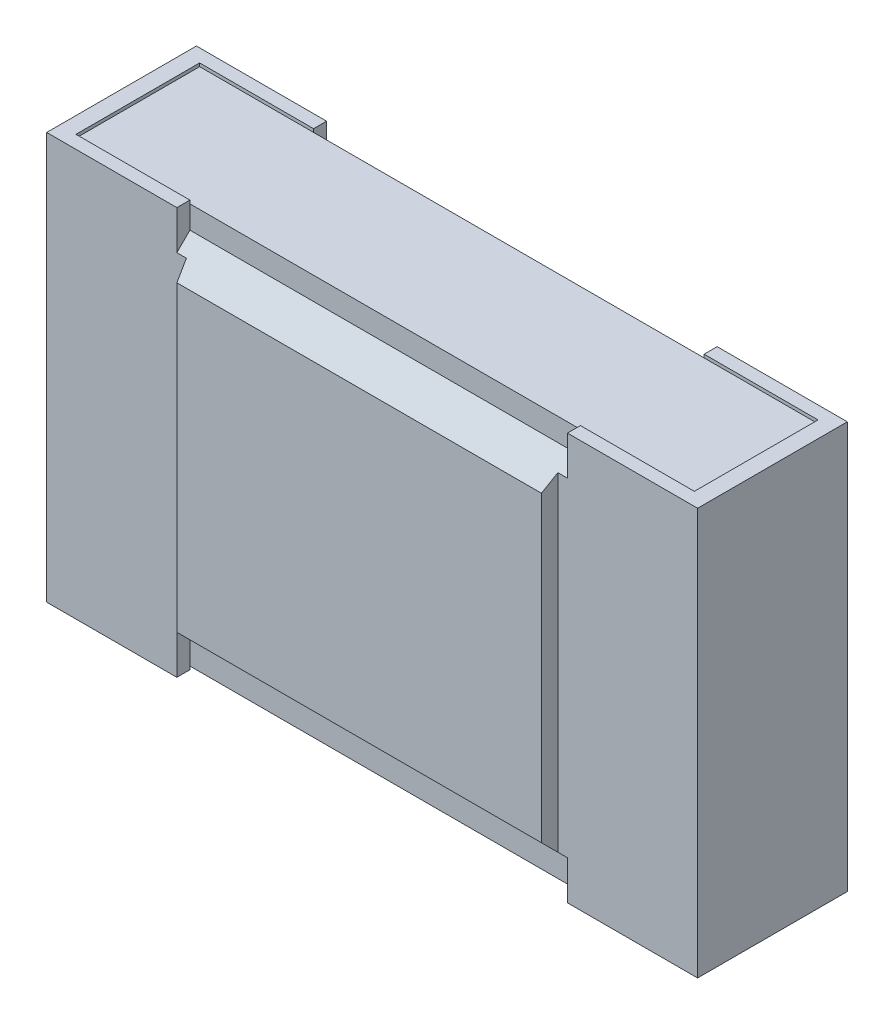
ISO-10303-21;
HEADER;
FILE_DESCRIPTION(('STEP AP214'),'2;1');
FILE_NAME('part.step','',(''),(''),'','','');
FILE_SCHEMA(('AUTOMOTIVE_DESIGN { 1 0 10303 214 1 1 1 1 }'));
ENDSEC;
DATA;
#1=APPLICATION_CONTEXT('core data for automotive mechanical design processes');
#2=APPLICATION_PROTOCOL_DEFINITION('international standard','automotive_design',2000,#1);
#3=PRODUCT_CONTEXT('',#1,'mechanical');
#4=PRODUCT('Part','Part','',(#3));
#5=PRODUCT_RELATED_PRODUCT_CATEGORY('part','',(#4));
#6=PRODUCT_DEFINITION_FORMATION('','',#4);
#7=PRODUCT_DEFINITION_CONTEXT('part definition',#1,'design');
#8=PRODUCT_DEFINITION('design','',#6,#7);
#9=PRODUCT_DEFINITION_SHAPE('','',#8);
#10=(LENGTH_UNIT() NAMED_UNIT(*) SI_UNIT(.MILLI.,.METRE.));
#11=(NAMED_UNIT(*) PLANE_ANGLE_UNIT() SI_UNIT($,.RADIAN.));
#12=(NAMED_UNIT(*) SI_UNIT($,.STERADIAN.) SOLID_ANGLE_UNIT());
#13=UNCERTAINTY_MEASURE_WITH_UNIT(LENGTH_MEASURE(1.E-05),#10,'distance_accuracy_value','');
#14=(GEOMETRIC_REPRESENTATION_CONTEXT(3) GLOBAL_UNCERTAINTY_ASSIGNED_CONTEXT((#13)) GLOBAL_UNIT_ASSIGNED_CONTEXT((#10,
#11,#12)) REPRESENTATION_CONTEXT('',''));
#15=CARTESIAN_POINT('',(0.,0.,0.));
#16=DIRECTION('',(0.,0.,1.));
#17=DIRECTION('',(1.,0.,0.));
#18=AXIS2_PLACEMENT_3D('',#15,#16,#17);
#19=CARTESIAN_POINT('',(0.6,-0.625,0.350717967697239));
#20=DIRECTION('',(0.965925826289069,0.,0.258819045102518));
#21=DIRECTION('',(0.258819045102518,0.,-0.965925826289069));
#22=AXIS2_PLACEMENT_3D('',#19,#20,#21);
#23=PLANE('',#22);
#24=DIRECTION('',(-0.186156787897384,0.694746590606862,0.69474659060687));
#25=VECTOR('',#24,1.);
#26=CARTESIAN_POINT('',(0.570717967697244,-0.504999999999999,0.46));
#27=LINE('',#26,#25);
#28=CARTESIAN_POINT('',(0.570717967697244,-0.504999999999999,0.46));
#29=VERTEX_POINT('',#28);
#30=CARTESIAN_POINT('',(0.559999999999999,-0.464999999999999,0.5));
#31=VERTEX_POINT('',#30);
#32=EDGE_CURVE('E277',#29,#31,#27,.T.);
#33=ORIENTED_EDGE('',*,*,#32,.F.);
#34=DIRECTION('',(0.,1.,0.));
#35=VECTOR('',#34,1.);
#36=CARTESIAN_POINT('',(0.570717967697244,0.,0.46));
#37=LINE('',#36,#35);
#38=CARTESIAN_POINT('',(0.570717967697244,0.504999999999999,0.46));
#39=VERTEX_POINT('',#38);
#40=EDGE_CURVE('E230',#39,#29,#37,.F.);
#41=ORIENTED_EDGE('',*,*,#40,.F.);
#42=DIRECTION('',(0.186156787897384,0.694746590606862,-0.69474659060687));
#43=VECTOR('',#42,1.);
#44=CARTESIAN_POINT('',(0.559999999999999,0.464999999999999,0.5));
#45=LINE('',#44,#43);
#46=CARTESIAN_POINT('',(0.559999999999999,0.464999999999999,0.5));
#47=VERTEX_POINT('',#46);
#48=EDGE_CURVE('E226',#47,#39,#45,.T.);
#49=ORIENTED_EDGE('',*,*,#48,.F.);
#50=DIRECTION('',(0.,1.,0.));
#51=VECTOR('',#50,1.);
#52=CARTESIAN_POINT('',(0.559999999999999,0.,0.5));
#53=LINE('',#52,#51);
#54=EDGE_CURVE('E19',#31,#47,#53,.T.);
#55=ORIENTED_EDGE('',*,*,#54,.F.);
#56=EDGE_LOOP('',(#33,#41,#49,#55));
#57=FACE_BOUND('',#56,.T.);
#58=ADVANCED_FACE('F16',(#57),#23,.T.);
#59=CARTESIAN_POINT('',(0.,0.,0.5));
#60=DIRECTION('',(0.,0.,1.));
#61=DIRECTION('',(1.,0.,0.));
#62=AXIS2_PLACEMENT_3D('',#59,#60,#61);
#63=PLANE('',#62);
#64=DIRECTION('',(1.,0.,0.));
#65=VECTOR('',#64,1.);
#66=CARTESIAN_POINT('',(-0.6,0.464999999999999,0.5));
#67=LINE('',#66,#65);
#68=CARTESIAN_POINT('',(-0.559999999999999,0.464999999999999,0.5));
#69=VERTEX_POINT('',#68);
#70=EDGE_CURVE('E240',#69,#47,#67,.T.);
#71=ORIENTED_EDGE('',*,*,#70,.F.);
#72=DIRECTION('',(0.,1.,0.));
#73=VECTOR('',#72,1.);
#74=CARTESIAN_POINT('',(-0.559999999999999,-0.625,0.5));
#75=LINE('',#74,#73);
#76=CARTESIAN_POINT('',(-0.559999999999999,-0.464999999999999,0.5));
#77=VERTEX_POINT('',#76);
#78=EDGE_CURVE('E245',#77,#69,#75,.T.);
#79=ORIENTED_EDGE('',*,*,#78,.F.);
#80=DIRECTION('',(1.,0.,0.));
#81=VECTOR('',#80,1.);
#82=CARTESIAN_POINT('',(-0.6,-0.464999999999999,0.5));
#83=LINE('',#82,#81);
#84=EDGE_CURVE('E243',#31,#77,#83,.F.);
#85=ORIENTED_EDGE('',*,*,#84,.F.);
#86=ORIENTED_EDGE('',*,*,#54,.T.);
#87=EDGE_LOOP('',(#71,#79,#85,#86));
#88=FACE_BOUND('',#87,.T.);
#89=ADVANCED_FACE('F239',(#88),#63,.T.);
#90=CARTESIAN_POINT('',(-0.6,-0.625,0.350717967697239));
#91=DIRECTION('',(-0.965925826289069,0.,0.258819045102518));
#92=DIRECTION('',(0.258819045102518,0.,0.965925826289069));
#93=AXIS2_PLACEMENT_3D('',#90,#91,#92);
#94=PLANE('',#93);
#95=DIRECTION('',(0.186156787897384,-0.694746590606862,0.69474659060687));
#96=VECTOR('',#95,1.);
#97=CARTESIAN_POINT('',(-0.570717967697243,0.504999999999999,0.46));
#98=LINE('',#97,#96);
#99=CARTESIAN_POINT('',(-0.570717967697243,0.504999999999999,0.46));
#100=VERTEX_POINT('',#99);
#101=EDGE_CURVE('E249',#100,#69,#98,.T.);
#102=ORIENTED_EDGE('',*,*,#101,.F.);
#103=DIRECTION('',(0.,1.,0.));
#104=VECTOR('',#103,1.);
#105=CARTESIAN_POINT('',(-0.570717967697243,0.,0.46));
#106=LINE('',#105,#104);
#107=CARTESIAN_POINT('',(-0.570717967697243,-0.504999999999999,0.46));
#108=VERTEX_POINT('',#107);
#109=EDGE_CURVE('E264',#100,#108,#106,.F.);
#110=ORIENTED_EDGE('',*,*,#109,.T.);
#111=DIRECTION('',(-0.186156787897385,-0.694746590606862,-0.69474659060687));
#112=VECTOR('',#111,1.);
#113=CARTESIAN_POINT('',(-0.559999999999999,-0.464999999999999,0.5));
#114=LINE('',#113,#112);
#115=EDGE_CURVE('E269',#77,#108,#114,.T.);
#116=ORIENTED_EDGE('',*,*,#115,.F.);
#117=ORIENTED_EDGE('',*,*,#78,.T.);
#118=EDGE_LOOP('',(#102,#110,#116,#117));
#119=FACE_BOUND('',#118,.T.);
#120=ADVANCED_FACE('F267',(#119),#94,.T.);
#121=CARTESIAN_POINT('',(0.,0.,0.46));
#122=DIRECTION('',(0.,0.,-1.));
#123=DIRECTION('',(-1.,0.,0.));
#124=AXIS2_PLACEMENT_3D('',#121,#122,#123);
#125=PLANE('',#124);
#126=DIRECTION('',(1.,0.,0.));
#127=VECTOR('',#126,1.);
#128=CARTESIAN_POINT('',(-0.6,-0.504999999999999,0.46));
#129=LINE('',#128,#127);
#130=CARTESIAN_POINT('',(-0.6,-0.504999999999999,0.46));
#131=VERTEX_POINT('',#130);
#132=EDGE_CURVE('E273',#108,#131,#129,.F.);
#133=ORIENTED_EDGE('',*,*,#132,.F.);
#134=ORIENTED_EDGE('',*,*,#109,.F.);
#135=DIRECTION('',(1.,0.,0.));
#136=VECTOR('',#135,1.);
#137=CARTESIAN_POINT('',(-0.6,0.504999999999999,0.46));
#138=LINE('',#137,#136);
#139=CARTESIAN_POINT('',(-0.6,0.504999999999999,0.46));
#140=VERTEX_POINT('',#139);
#141=EDGE_CURVE('E254',#140,#100,#138,.T.);
#142=ORIENTED_EDGE('',*,*,#141,.F.);
#143=DIRECTION('',(0.,1.,0.));
#144=VECTOR('',#143,1.);
#145=CARTESIAN_POINT('',(-0.6,0.625,0.46));
#146=LINE('',#145,#144);
#147=CARTESIAN_POINT('',(-0.6,0.625,0.46));
#148=VERTEX_POINT('',#147);
#149=EDGE_CURVE('E221',#140,#148,#146,.T.);
#150=ORIENTED_EDGE('',*,*,#149,.T.);
#151=DIRECTION('',(1.,0.,0.));
#152=VECTOR('',#151,1.);
#153=CARTESIAN_POINT('',(1.,0.625,0.46));
#154=LINE('',#153,#152);
#155=CARTESIAN_POINT('',(-1.,0.625,0.46));
#156=VERTEX_POINT('',#155);
#157=EDGE_CURVE('E339',#148,#156,#154,.F.);
#158=ORIENTED_EDGE('',*,*,#157,.T.);
#159=DIRECTION('',(0.,1.,0.));
#160=VECTOR('',#159,1.);
#161=CARTESIAN_POINT('',(-1.,-0.625,0.46));
#162=LINE('',#161,#160);
#163=CARTESIAN_POINT('',(-1.,-0.625,0.46));
#164=VERTEX_POINT('',#163);
#165=EDGE_CURVE('E262',#156,#164,#162,.F.);
#166=ORIENTED_EDGE('',*,*,#165,.T.);
#167=DIRECTION('',(-1.,0.,0.));
#168=VECTOR('',#167,1.);
#169=CARTESIAN_POINT('',(1.,-0.625,0.46));
#170=LINE('',#169,#168);
#171=CARTESIAN_POINT('',(-0.6,-0.625,0.46));
#172=VERTEX_POINT('',#171);
#173=EDGE_CURVE('E345',#164,#172,#170,.F.);
#174=ORIENTED_EDGE('',*,*,#173,.T.);
#175=DIRECTION('',(0.,1.,0.));
#176=VECTOR('',#175,1.);
#177=CARTESIAN_POINT('',(-0.6,-0.625,0.46));
#178=LINE('',#177,#176);
#179=EDGE_CURVE('E352',#172,#131,#178,.T.);
#180=ORIENTED_EDGE('',*,*,#179,.T.);
#181=EDGE_LOOP('',(#133,#134,#142,#150,#158,#166,#174,#180));
#182=FACE_BOUND('',#181,.T.);
#183=ADVANCED_FACE('F894',(#182),#125,.F.);
#184=CARTESIAN_POINT('',(-1.,-0.625,0.5));
#185=DIRECTION('',(1.,0.,0.));
#186=DIRECTION('',(0.,0.,-1.));
#187=AXIS2_PLACEMENT_3D('',#184,#185,#186);
#188=PLANE('',#187);
#189=ORIENTED_EDGE('',*,*,#165,.F.);
#190=DIRECTION('',(0.,0.,1.));
#191=VECTOR('',#190,1.);
#192=CARTESIAN_POINT('',(-1.,0.625,0.5));
#193=LINE('',#192,#191);
#194=CARTESIAN_POINT('',(-1.,0.625,0.));
#195=VERTEX_POINT('',#194);
#196=EDGE_CURVE('E337',#156,#195,#193,.F.);
#197=ORIENTED_EDGE('',*,*,#196,.T.);
#198=DIRECTION('',(0.,1.,0.));
#199=VECTOR('',#198,1.);
#200=CARTESIAN_POINT('',(-1.,0.,0.));
#201=LINE('',#200,#199);
#202=CARTESIAN_POINT('',(-1.,-0.625,0.));
#203=VERTEX_POINT('',#202);
#204=EDGE_CURVE('E335',#195,#203,#201,.F.);
#205=ORIENTED_EDGE('',*,*,#204,.T.);
#206=DIRECTION('',(0.,0.,1.));
#207=VECTOR('',#206,1.);
#208=CARTESIAN_POINT('',(-1.,-0.625,0.5));
#209=LINE('',#208,#207);
#210=EDGE_CURVE('E347',#203,#164,#209,.T.);
#211=ORIENTED_EDGE('',*,*,#210,.T.);
#212=EDGE_LOOP('',(#189,#197,#205,#211));
#213=FACE_BOUND('',#212,.T.);
#214=ADVANCED_FACE('F886',(#213),#188,.F.);
#215=CARTESIAN_POINT('',(-0.6,0.625,0.42));
#216=DIRECTION('',(-1.,0.,0.));
#217=DIRECTION('',(0.,0.,1.));
#218=AXIS2_PLACEMENT_3D('',#215,#216,#217);
#219=PLANE('',#218);
#220=DIRECTION('',(0.,-0.707106781186544,0.707106781186551));
#221=VECTOR('',#220,1.);
#222=CARTESIAN_POINT('',(-0.6,0.605,0.359999999999998));
#223=LINE('',#222,#221);
#224=CARTESIAN_POINT('',(-0.6,0.544999999999998,0.42));
#225=VERTEX_POINT('',#224);
#226=EDGE_CURVE('E235',#225,#140,#223,.T.);
#227=ORIENTED_EDGE('',*,*,#226,.F.);
#228=DIRECTION('',(0.,1.,0.));
#229=VECTOR('',#228,1.);
#230=CARTESIAN_POINT('',(-0.599999999999999,0.,0.42));
#231=LINE('',#230,#229);
#232=CARTESIAN_POINT('',(-0.6,0.615,0.42));
#233=VERTEX_POINT('',#232);
#234=EDGE_CURVE('E308',#233,#225,#231,.F.);
#235=ORIENTED_EDGE('',*,*,#234,.F.);
#236=DIRECTION('',(0.,1.,0.));
#237=VECTOR('',#236,1.);
#238=CARTESIAN_POINT('',(-0.599999999999999,0.615,0.42));
#239=LINE('',#238,#237);
#240=CARTESIAN_POINT('',(-0.6,0.625,0.42));
#241=VERTEX_POINT('',#240);
#242=EDGE_CURVE('E326',#241,#233,#239,.F.);
#243=ORIENTED_EDGE('',*,*,#242,.F.);
#244=DIRECTION('',(0.,0.,1.));
#245=VECTOR('',#244,1.);
#246=CARTESIAN_POINT('',(-0.599999999999999,0.625,0.5));
#247=LINE('',#246,#245);
#248=EDGE_CURVE('E341',#241,#148,#247,.T.);
#249=ORIENTED_EDGE('',*,*,#248,.T.);
#250=ORIENTED_EDGE('',*,*,#149,.F.);
#251=EDGE_LOOP('',(#227,#235,#243,#249,#250));
#252=FACE_BOUND('',#251,.T.);
#253=ADVANCED_FACE('F877',(#252),#219,.F.);
#254=CARTESIAN_POINT('',(-0.6,0.605,0.359999999999998));
#255=DIRECTION('',(0.,0.707106781186551,0.707106781186544));
#256=DIRECTION('',(0.,-0.707106781186544,0.707106781186551));
#257=AXIS2_PLACEMENT_3D('',#254,#255,#256);
#258=PLANE('',#257);
#259=ORIENTED_EDGE('',*,*,#101,.T.);
#260=ORIENTED_EDGE('',*,*,#70,.T.);
#261=ORIENTED_EDGE('',*,*,#48,.T.);
#262=DIRECTION('',(1.,0.,0.));
#263=VECTOR('',#262,1.);
#264=CARTESIAN_POINT('',(0.,0.504999999999999,0.46));
#265=LINE('',#264,#263);
#266=CARTESIAN_POINT('',(0.6,0.504999999999999,0.46));
#267=VERTEX_POINT('',#266);
#268=EDGE_CURVE('E287',#267,#39,#265,.F.);
#269=ORIENTED_EDGE('',*,*,#268,.F.);
#270=DIRECTION('',(0.,0.707106781186543,-0.707106781186552));
#271=VECTOR('',#270,1.);
#272=CARTESIAN_POINT('',(0.6,0.504999999999999,0.46));
#273=LINE('',#272,#271);
#274=CARTESIAN_POINT('',(0.6,0.544999999999998,0.42));
#275=VERTEX_POINT('',#274);
#276=EDGE_CURVE('E250',#267,#275,#273,.T.);
#277=ORIENTED_EDGE('',*,*,#276,.T.);
#278=DIRECTION('',(1.,0.,0.));
#279=VECTOR('',#278,1.);
#280=CARTESIAN_POINT('',(0.,0.544999999999998,0.42));
#281=LINE('',#280,#279);
#282=EDGE_CURVE('E304',#225,#275,#281,.T.);
#283=ORIENTED_EDGE('',*,*,#282,.F.);
#284=ORIENTED_EDGE('',*,*,#226,.T.);
#285=ORIENTED_EDGE('',*,*,#141,.T.);
#286=EDGE_LOOP('',(#259,#260,#261,#269,#277,#283,#284,#285));
#287=FACE_BOUND('',#286,.T.);
#288=ADVANCED_FACE('F246',(#287),#258,.T.);
#289=CARTESIAN_POINT('',(0.6,0.625,0.42));
#290=DIRECTION('',(1.,0.,0.));
#291=DIRECTION('',(0.,0.,-1.));
#292=AXIS2_PLACEMENT_3D('',#289,#290,#291);
#293=PLANE('',#292);
#294=DIRECTION('',(0.,0.,1.));
#295=VECTOR('',#294,1.);
#296=CARTESIAN_POINT('',(0.6,0.625,0.5));
#297=LINE('',#296,#295);
#298=CARTESIAN_POINT('',(0.6,0.625,0.46));
#299=VERTEX_POINT('',#298);
#300=CARTESIAN_POINT('',(0.6,0.625,0.42));
#301=VERTEX_POINT('',#300);
#302=EDGE_CURVE('E297',#299,#301,#297,.F.);
#303=ORIENTED_EDGE('',*,*,#302,.T.);
#304=DIRECTION('',(0.,1.,0.));
#305=VECTOR('',#304,1.);
#306=CARTESIAN_POINT('',(0.6,0.615,0.42));
#307=LINE('',#306,#305);
#308=CARTESIAN_POINT('',(0.6,0.615,0.42));
#309=VERTEX_POINT('',#308);
#310=EDGE_CURVE('E307',#309,#301,#307,.T.);
#311=ORIENTED_EDGE('',*,*,#310,.F.);
#312=DIRECTION('',(0.,1.,0.));
#313=VECTOR('',#312,1.);
#314=CARTESIAN_POINT('',(0.6,0.,0.42));
#315=LINE('',#314,#313);
#316=EDGE_CURVE('E301',#275,#309,#315,.T.);
#317=ORIENTED_EDGE('',*,*,#316,.F.);
#318=ORIENTED_EDGE('',*,*,#276,.F.);
#319=DIRECTION('',(0.,1.,0.));
#320=VECTOR('',#319,1.);
#321=CARTESIAN_POINT('',(0.6,0.,0.46));
#322=LINE('',#321,#320);
#323=EDGE_CURVE('E252',#299,#267,#322,.F.);
#324=ORIENTED_EDGE('',*,*,#323,.F.);
#325=EDGE_LOOP('',(#303,#311,#317,#318,#324));
#326=FACE_BOUND('',#325,.T.);
#327=ADVANCED_FACE('F296',(#326),#293,.F.);
#328=CARTESIAN_POINT('',(0.,0.,0.46));
#329=DIRECTION('',(0.,0.,1.));
#330=DIRECTION('',(1.,0.,0.));
#331=AXIS2_PLACEMENT_3D('',#328,#329,#330);
#332=PLANE('',#331);
#333=DIRECTION('',(0.,1.,0.));
#334=VECTOR('',#333,1.);
#335=CARTESIAN_POINT('',(1.,-0.625,0.46));
#336=LINE('',#335,#334);
#337=CARTESIAN_POINT('',(1.,-0.625,0.46));
#338=VERTEX_POINT('',#337);
#339=CARTESIAN_POINT('',(1.,0.625,0.46));
#340=VERTEX_POINT('',#339);
#341=EDGE_CURVE('E284',#338,#340,#336,.T.);
#342=ORIENTED_EDGE('',*,*,#341,.T.);
#343=DIRECTION('',(1.,0.,0.));
#344=VECTOR('',#343,1.);
#345=CARTESIAN_POINT('',(1.,0.625,0.46));
#346=LINE('',#345,#344);
#347=EDGE_CURVE('E293',#340,#299,#346,.F.);
#348=ORIENTED_EDGE('',*,*,#347,.T.);
#349=ORIENTED_EDGE('',*,*,#323,.T.);
#350=ORIENTED_EDGE('',*,*,#268,.T.);
#351=ORIENTED_EDGE('',*,*,#40,.T.);
#352=DIRECTION('',(1.,0.,0.));
#353=VECTOR('',#352,1.);
#354=CARTESIAN_POINT('',(-0.6,-0.504999999999999,0.46));
#355=LINE('',#354,#353);
#356=CARTESIAN_POINT('',(0.6,-0.504999999999999,0.46));
#357=VERTEX_POINT('',#356);
#358=EDGE_CURVE('E279',#357,#29,#355,.F.);
#359=ORIENTED_EDGE('',*,*,#358,.F.);
#360=DIRECTION('',(0.,1.,0.));
#361=VECTOR('',#360,1.);
#362=CARTESIAN_POINT('',(0.6,-0.625,0.46));
#363=LINE('',#362,#361);
#364=CARTESIAN_POINT('',(0.6,-0.625,0.46));
#365=VERTEX_POINT('',#364);
#366=EDGE_CURVE('E354',#357,#365,#363,.F.);
#367=ORIENTED_EDGE('',*,*,#366,.T.);
#368=DIRECTION('',(-1.,0.,0.));
#369=VECTOR('',#368,1.);
#370=CARTESIAN_POINT('',(1.,-0.625,0.46));
#371=LINE('',#370,#369);
#372=EDGE_CURVE('E414',#365,#338,#371,.F.);
#373=ORIENTED_EDGE('',*,*,#372,.T.);
#374=EDGE_LOOP('',(#342,#348,#349,#350,#351,#359,#367,#373));
#375=FACE_BOUND('',#374,.T.);
#376=ADVANCED_FACE('F291',(#375),#332,.T.);
#377=CARTESIAN_POINT('',(1.,-0.625,0.5));
#378=DIRECTION('',(-1.,0.,0.));
#379=DIRECTION('',(0.,0.,1.));
#380=AXIS2_PLACEMENT_3D('',#377,#378,#379);
#381=PLANE('',#380);
#382=DIRECTION('',(0.,0.,1.));
#383=VECTOR('',#382,1.);
#384=CARTESIAN_POINT('',(1.,-0.625,0.5));
#385=LINE('',#384,#383);
#386=CARTESIAN_POINT('',(1.,-0.625,0.));
#387=VERTEX_POINT('',#386);
#388=EDGE_CURVE('E412',#338,#387,#385,.F.);
#389=ORIENTED_EDGE('',*,*,#388,.T.);
#390=DIRECTION('',(0.,1.,0.));
#391=VECTOR('',#390,1.);
#392=CARTESIAN_POINT('',(1.,0.,0.));
#393=LINE('',#392,#391);
#394=CARTESIAN_POINT('',(1.,0.625,0.));
#395=VERTEX_POINT('',#394);
#396=EDGE_CURVE('E407',#387,#395,#393,.T.);
#397=ORIENTED_EDGE('',*,*,#396,.T.);
#398=DIRECTION('',(0.,0.,1.));
#399=VECTOR('',#398,1.);
#400=CARTESIAN_POINT('',(1.,0.625,0.5));
#401=LINE('',#400,#399);
#402=EDGE_CURVE('E428',#395,#340,#401,.T.);
#403=ORIENTED_EDGE('',*,*,#402,.T.);
#404=ORIENTED_EDGE('',*,*,#341,.F.);
#405=EDGE_LOOP('',(#389,#397,#403,#404));
#406=FACE_BOUND('',#405,.T.);
#407=ADVANCED_FACE('F593',(#406),#381,.F.);
#408=CARTESIAN_POINT('',(-0.6,-0.605,0.359999999999998));
#409=DIRECTION('',(0.,-0.707106781186551,0.707106781186544));
#410=DIRECTION('',(0.,-0.707106781186544,-0.707106781186551));
#411=AXIS2_PLACEMENT_3D('',#408,#409,#410);
#412=PLANE('',#411);
#413=DIRECTION('',(0.,-0.707106781186544,-0.707106781186551));
#414=VECTOR('',#413,1.);
#415=CARTESIAN_POINT('',(-0.6,-0.504999999999999,0.46));
#416=LINE('',#415,#414);
#417=CARTESIAN_POINT('',(-0.6,-0.544999999999998,0.42));
#418=VERTEX_POINT('',#417);
#419=EDGE_CURVE('E350',#131,#418,#416,.T.);
#420=ORIENTED_EDGE('',*,*,#419,.T.);
#421=DIRECTION('',(-1.,0.,0.));
#422=VECTOR('',#421,1.);
#423=CARTESIAN_POINT('',(0.,-0.544999999999998,0.42));
#424=LINE('',#423,#422);
#425=CARTESIAN_POINT('',(0.6,-0.544999999999998,0.42));
#426=VERTEX_POINT('',#425);
#427=EDGE_CURVE('E373',#418,#426,#424,.F.);
#428=ORIENTED_EDGE('',*,*,#427,.T.);
#429=DIRECTION('',(0.,0.707106781186544,0.707106781186551));
#430=VECTOR('',#429,1.);
#431=CARTESIAN_POINT('',(0.6,-0.544999999999998,0.42));
#432=LINE('',#431,#430);
#433=EDGE_CURVE('E356',#426,#357,#432,.T.);
#434=ORIENTED_EDGE('',*,*,#433,.T.);
#435=ORIENTED_EDGE('',*,*,#358,.T.);
#436=ORIENTED_EDGE('',*,*,#32,.T.);
#437=ORIENTED_EDGE('',*,*,#84,.T.);
#438=ORIENTED_EDGE('',*,*,#115,.T.);
#439=ORIENTED_EDGE('',*,*,#132,.T.);
#440=EDGE_LOOP('',(#420,#428,#434,#435,#436,#437,#438,#439));
#441=FACE_BOUND('',#440,.T.);
#442=ADVANCED_FACE('F275',(#441),#412,.T.);
#443=CARTESIAN_POINT('',(0.6,-0.625,0.42));
#444=DIRECTION('',(1.,0.,0.));
#445=DIRECTION('',(0.,0.,-1.));
#446=AXIS2_PLACEMENT_3D('',#443,#444,#445);
#447=PLANE('',#446);
#448=ORIENTED_EDGE('',*,*,#433,.F.);
#449=DIRECTION('',(0.,1.,0.));
#450=VECTOR('',#449,1.);
#451=CARTESIAN_POINT('',(0.6,0.,0.42));
#452=LINE('',#451,#450);
#453=CARTESIAN_POINT('',(0.6,-0.615,0.42));
#454=VERTEX_POINT('',#453);
#455=EDGE_CURVE('E378',#426,#454,#452,.F.);
#456=ORIENTED_EDGE('',*,*,#455,.T.);
#457=DIRECTION('',(0.,1.,0.));
#458=VECTOR('',#457,1.);
#459=CARTESIAN_POINT('',(0.6,-0.615,0.42));
#460=LINE('',#459,#458);
#461=CARTESIAN_POINT('',(0.6,-0.625,0.42));
#462=VERTEX_POINT('',#461);
#463=EDGE_CURVE('E387',#454,#462,#460,.F.);
#464=ORIENTED_EDGE('',*,*,#463,.T.);
#465=DIRECTION('',(0.,0.,1.));
#466=VECTOR('',#465,1.);
#467=CARTESIAN_POINT('',(0.6,-0.625,0.5));
#468=LINE('',#467,#466);
#469=EDGE_CURVE('E409',#462,#365,#468,.T.);
#470=ORIENTED_EDGE('',*,*,#469,.T.);
#471=ORIENTED_EDGE('',*,*,#366,.F.);
#472=EDGE_LOOP('',(#448,#456,#464,#470,#471));
#473=FACE_BOUND('',#472,.T.);
#474=ADVANCED_FACE('F589',(#473),#447,.F.);
#475=CARTESIAN_POINT('',(-0.6,-0.625,0.42));
#476=DIRECTION('',(-1.,0.,0.));
#477=DIRECTION('',(0.,0.,1.));
#478=AXIS2_PLACEMENT_3D('',#475,#476,#477);
#479=PLANE('',#478);
#480=DIRECTION('',(0.,1.,0.));
#481=VECTOR('',#480,1.);
#482=CARTESIAN_POINT('',(-0.599999999999999,-0.615,0.42));
#483=LINE('',#482,#481);
#484=CARTESIAN_POINT('',(-0.6,-0.625,0.42));
#485=VERTEX_POINT('',#484);
#486=CARTESIAN_POINT('',(-0.6,-0.615,0.42));
#487=VERTEX_POINT('',#486);
#488=EDGE_CURVE('E369',#485,#487,#483,.T.);
#489=ORIENTED_EDGE('',*,*,#488,.T.);
#490=DIRECTION('',(0.,1.,0.));
#491=VECTOR('',#490,1.);
#492=CARTESIAN_POINT('',(-0.599999999999999,0.,0.42));
#493=LINE('',#492,#491);
#494=EDGE_CURVE('E366',#487,#418,#493,.T.);
#495=ORIENTED_EDGE('',*,*,#494,.T.);
#496=ORIENTED_EDGE('',*,*,#419,.F.);
#497=ORIENTED_EDGE('',*,*,#179,.F.);
#498=DIRECTION('',(0.,0.,1.));
#499=VECTOR('',#498,1.);
#500=CARTESIAN_POINT('',(-0.6,-0.625,0.5));
#501=LINE('',#500,#499);
#502=EDGE_CURVE('E343',#172,#485,#501,.F.);
#503=ORIENTED_EDGE('',*,*,#502,.T.);
#504=EDGE_LOOP('',(#489,#495,#496,#497,#503));
#505=FACE_BOUND('',#504,.T.);
#506=ADVANCED_FACE('F363',(#505),#479,.F.);
#507=CARTESIAN_POINT('',(1.,-0.625,0.5));
#508=DIRECTION('',(0.,1.,0.));
#509=DIRECTION('',(-1.,0.,0.));
#510=AXIS2_PLACEMENT_3D('',#507,#508,#509);
#511=PLANE('',#510);
#512=DIRECTION('',(1.,0.,0.));
#513=VECTOR('',#512,1.);
#514=CARTESIAN_POINT('',(0.950000000000001,-0.625,0.42));
#515=LINE('',#514,#513);
#516=CARTESIAN_POINT('',(-0.95,-0.625,0.42));
#517=VERTEX_POINT('',#516);
#518=EDGE_CURVE('E482',#517,#485,#515,.T.);
#519=ORIENTED_EDGE('',*,*,#518,.T.);
#520=ORIENTED_EDGE('',*,*,#502,.F.);
#521=ORIENTED_EDGE('',*,*,#173,.F.);
#522=ORIENTED_EDGE('',*,*,#210,.F.);
#523=DIRECTION('',(1.,0.,0.));
#524=VECTOR('',#523,1.);
#525=CARTESIAN_POINT('',(0.,-0.625,0.));
#526=LINE('',#525,#524);
#527=CARTESIAN_POINT('',(-0.6,-0.625,0.));
#528=VERTEX_POINT('',#527);
#529=EDGE_CURVE('E333',#203,#528,#526,.T.);
#530=ORIENTED_EDGE('',*,*,#529,.T.);
#531=DIRECTION('',(0.,0.,1.));
#532=VECTOR('',#531,1.);
#533=CARTESIAN_POINT('',(-0.6,-0.625,0.04));
#534=LINE('',#533,#532);
#535=CARTESIAN_POINT('',(-0.6,-0.625,0.04));
#536=VERTEX_POINT('',#535);
#537=EDGE_CURVE('E480',#528,#536,#534,.T.);
#538=ORIENTED_EDGE('',*,*,#537,.T.);
#539=DIRECTION('',(-1.,0.,0.));
#540=VECTOR('',#539,1.);
#541=CARTESIAN_POINT('',(0.950000000000001,-0.625,0.0400000000000002));
#542=LINE('',#541,#540);
#543=CARTESIAN_POINT('',(-0.95,-0.625,0.0399999999999999));
#544=VERTEX_POINT('',#543);
#545=EDGE_CURVE('E398',#536,#544,#542,.T.);
#546=ORIENTED_EDGE('',*,*,#545,.T.);
#547=DIRECTION('',(0.,0.,1.));
#548=VECTOR('',#547,1.);
#549=CARTESIAN_POINT('',(-0.95,-0.625,0.04));
#550=LINE('',#549,#548);
#551=EDGE_CURVE('E400',#544,#517,#550,.T.);
#552=ORIENTED_EDGE('',*,*,#551,.T.);
#553=EDGE_LOOP('',(#519,#520,#521,#522,#530,#538,#546,#552));
#554=FACE_BOUND('',#553,.T.);
#555=ADVANCED_FACE('F499',(#554),#511,.F.);
#556=CARTESIAN_POINT('',(1.,0.625,0.5));
#557=DIRECTION('',(0.,-1.,0.));
#558=DIRECTION('',(1.,0.,0.));
#559=AXIS2_PLACEMENT_3D('',#556,#557,#558);
#560=PLANE('',#559);
#561=DIRECTION('',(0.,0.,1.));
#562=VECTOR('',#561,1.);
#563=CARTESIAN_POINT('',(-0.6,0.625,0.04));
#564=LINE('',#563,#562);
#565=CARTESIAN_POINT('',(-0.6,0.625,0.04));
#566=VERTEX_POINT('',#565);
#567=CARTESIAN_POINT('',(-0.6,0.625,0.));
#568=VERTEX_POINT('',#567);
#569=EDGE_CURVE('E473',#566,#568,#564,.F.);
#570=ORIENTED_EDGE('',*,*,#569,.T.);
#571=DIRECTION('',(1.,0.,0.));
#572=VECTOR('',#571,1.);
#573=CARTESIAN_POINT('',(0.,0.625,0.));
#574=LINE('',#573,#572);
#575=EDGE_CURVE('E330',#568,#195,#574,.F.);
#576=ORIENTED_EDGE('',*,*,#575,.T.);
#577=ORIENTED_EDGE('',*,*,#196,.F.);
#578=ORIENTED_EDGE('',*,*,#157,.F.);
#579=ORIENTED_EDGE('',*,*,#248,.F.);
#580=DIRECTION('',(-1.,0.,0.));
#581=VECTOR('',#580,1.);
#582=CARTESIAN_POINT('',(0.950000000000001,0.625,0.42));
#583=LINE('',#582,#581);
#584=CARTESIAN_POINT('',(-0.95,0.625,0.42));
#585=VERTEX_POINT('',#584);
#586=EDGE_CURVE('E317',#585,#241,#583,.F.);
#587=ORIENTED_EDGE('',*,*,#586,.F.);
#588=DIRECTION('',(0.,0.,1.));
#589=VECTOR('',#588,1.);
#590=CARTESIAN_POINT('',(-0.95,0.625,0.04));
#591=LINE('',#590,#589);
#592=CARTESIAN_POINT('',(-0.95,0.625,0.04));
#593=VERTEX_POINT('',#592);
#594=EDGE_CURVE('E328',#593,#585,#591,.T.);
#595=ORIENTED_EDGE('',*,*,#594,.F.);
#596=DIRECTION('',(1.,0.,0.));
#597=VECTOR('',#596,1.);
#598=CARTESIAN_POINT('',(0.950000000000001,0.625,0.0400000000000002));
#599=LINE('',#598,#597);
#600=EDGE_CURVE('E434',#566,#593,#599,.F.);
#601=ORIENTED_EDGE('',*,*,#600,.F.);
#602=EDGE_LOOP('',(#570,#576,#577,#578,#579,#587,#595,#601));
#603=FACE_BOUND('',#602,.T.);
#604=ADVANCED_FACE('F659',(#603),#560,.F.);
#605=CARTESIAN_POINT('',(0.,0.,0.));
#606=DIRECTION('',(0.,0.,1.));
#607=DIRECTION('',(1.,0.,0.));
#608=AXIS2_PLACEMENT_3D('',#605,#606,#607);
#609=PLANE('',#608);
#610=DIRECTION('',(0.,1.,0.));
#611=VECTOR('',#610,1.);
#612=CARTESIAN_POINT('',(-0.6,0.625,0.));
#613=LINE('',#612,#611);
#614=EDGE_CURVE('E470',#568,#528,#613,.F.);
#615=ORIENTED_EDGE('',*,*,#614,.T.);
#616=ORIENTED_EDGE('',*,*,#529,.F.);
#617=ORIENTED_EDGE('',*,*,#204,.F.);
#618=ORIENTED_EDGE('',*,*,#575,.F.);
#619=EDGE_LOOP('',(#615,#616,#617,#618));
#620=FACE_BOUND('',#619,.T.);
#621=ADVANCED_FACE('F655',(#620),#609,.F.);
#622=CARTESIAN_POINT('',(-0.95,0.615,0.04));
#623=DIRECTION('',(1.,0.,0.));
#624=DIRECTION('',(0.,1.,0.));
#625=AXIS2_PLACEMENT_3D('',#622,#623,#624);
#626=PLANE('',#625);
#627=DIRECTION('',(0.,0.,1.));
#628=VECTOR('',#627,1.);
#629=CARTESIAN_POINT('',(-0.95,0.615,0.));
#630=LINE('',#629,#628);
#631=CARTESIAN_POINT('',(-0.95,0.615,0.04));
#632=VERTEX_POINT('',#631);
#633=CARTESIAN_POINT('',(-0.95,0.615,0.42));
#634=VERTEX_POINT('',#633);
#635=EDGE_CURVE('E467',#632,#634,#630,.T.);
#636=ORIENTED_EDGE('',*,*,#635,.F.);
#637=DIRECTION('',(0.,1.,0.));
#638=VECTOR('',#637,1.);
#639=CARTESIAN_POINT('',(-0.95,0.615,0.0399999999999999));
#640=LINE('',#639,#638);
#641=EDGE_CURVE('E431',#593,#632,#640,.F.);
#642=ORIENTED_EDGE('',*,*,#641,.F.);
#643=ORIENTED_EDGE('',*,*,#594,.T.);
#644=DIRECTION('',(0.,1.,0.));
#645=VECTOR('',#644,1.);
#646=CARTESIAN_POINT('',(-0.95,0.615,0.42));
#647=LINE('',#646,#645);
#648=EDGE_CURVE('E323',#634,#585,#647,.T.);
#649=ORIENTED_EDGE('',*,*,#648,.F.);
#650=EDGE_LOOP('',(#636,#642,#643,#649));
#651=FACE_BOUND('',#650,.T.);
#652=ADVANCED_FACE('F651',(#651),#626,.T.);
#653=CARTESIAN_POINT('',(0.950000000000001,0.615,0.42));
#654=DIRECTION('',(0.,0.,-1.));
#655=DIRECTION('',(-1.,0.,0.));
#656=AXIS2_PLACEMENT_3D('',#653,#654,#655);
#657=PLANE('',#656);
#658=ORIENTED_EDGE('',*,*,#648,.T.);
#659=ORIENTED_EDGE('',*,*,#586,.T.);
#660=ORIENTED_EDGE('',*,*,#242,.T.);
#661=DIRECTION('',(-1.,0.,0.));
#662=VECTOR('',#661,1.);
#663=CARTESIAN_POINT('',(0.,0.615,0.42));
#664=LINE('',#663,#662);
#665=EDGE_CURVE('E462',#634,#233,#664,.F.);
#666=ORIENTED_EDGE('',*,*,#665,.F.);
#667=EDGE_LOOP('',(#658,#659,#660,#666));
#668=FACE_BOUND('',#667,.T.);
#669=ADVANCED_FACE('F648',(#668),#657,.T.);
#670=CARTESIAN_POINT('',(0.,0.,0.42));
#671=DIRECTION('',(0.,0.,1.));
#672=DIRECTION('',(1.,0.,0.));
#673=AXIS2_PLACEMENT_3D('',#670,#671,#672);
#674=PLANE('',#673);
#675=ORIENTED_EDGE('',*,*,#234,.T.);
#676=ORIENTED_EDGE('',*,*,#282,.T.);
#677=ORIENTED_EDGE('',*,*,#316,.T.);
#678=DIRECTION('',(-1.,0.,0.));
#679=VECTOR('',#678,1.);
#680=CARTESIAN_POINT('',(0.,0.615,0.42));
#681=LINE('',#680,#679);
#682=EDGE_CURVE('E313',#233,#309,#681,.F.);
#683=ORIENTED_EDGE('',*,*,#682,.F.);
#684=EDGE_LOOP('',(#675,#676,#677,#683));
#685=FACE_BOUND('',#684,.T.);
#686=ADVANCED_FACE('F311',(#685),#674,.T.);
#687=CARTESIAN_POINT('',(0.950000000000001,0.615,0.42));
#688=DIRECTION('',(0.,0.,-1.));
#689=DIRECTION('',(-1.,0.,0.));
#690=AXIS2_PLACEMENT_3D('',#687,#688,#689);
#691=PLANE('',#690);
#692=DIRECTION('',(0.,-1.,0.));
#693=VECTOR('',#692,1.);
#694=CARTESIAN_POINT('',(0.950000000000001,0.615,0.42));
#695=LINE('',#694,#693);
#696=CARTESIAN_POINT('',(0.950000000000001,0.615,0.42));
#697=VERTEX_POINT('',#696);
#698=CARTESIAN_POINT('',(0.950000000000001,0.625,0.42));
#699=VERTEX_POINT('',#698);
#700=EDGE_CURVE('E437',#697,#699,#695,.F.);
#701=ORIENTED_EDGE('',*,*,#700,.F.);
#702=DIRECTION('',(-1.,0.,0.));
#703=VECTOR('',#702,1.);
#704=CARTESIAN_POINT('',(0.,0.615,0.42));
#705=LINE('',#704,#703);
#706=EDGE_CURVE('E444',#309,#697,#705,.F.);
#707=ORIENTED_EDGE('',*,*,#706,.F.);
#708=ORIENTED_EDGE('',*,*,#310,.T.);
#709=DIRECTION('',(1.,0.,0.));
#710=VECTOR('',#709,1.);
#711=CARTESIAN_POINT('',(1.,0.625,0.42));
#712=LINE('',#711,#710);
#713=EDGE_CURVE('E424',#301,#699,#712,.T.);
#714=ORIENTED_EDGE('',*,*,#713,.T.);
#715=EDGE_LOOP('',(#701,#707,#708,#714));
#716=FACE_BOUND('',#715,.T.);
#717=ADVANCED_FACE('F442',(#716),#691,.T.);
#718=CARTESIAN_POINT('',(0.950000000000001,0.615,0.0400000000000002));
#719=DIRECTION('',(-1.,0.,0.));
#720=DIRECTION('',(0.,-1.,0.));
#721=AXIS2_PLACEMENT_3D('',#718,#719,#720);
#722=PLANE('',#721);
#723=DIRECTION('',(0.,0.,1.));
#724=VECTOR('',#723,1.);
#725=CARTESIAN_POINT('',(0.950000000000001,0.615,0.));
#726=LINE('',#725,#724);
#727=CARTESIAN_POINT('',(0.950000000000001,0.615,0.0400000000000002));
#728=VERTEX_POINT('',#727);
#729=EDGE_CURVE('E454',#697,#728,#726,.F.);
#730=ORIENTED_EDGE('',*,*,#729,.F.);
#731=ORIENTED_EDGE('',*,*,#700,.T.);
#732=DIRECTION('',(0.,0.,1.));
#733=VECTOR('',#732,1.);
#734=CARTESIAN_POINT('',(0.950000000000001,0.625,0.5));
#735=LINE('',#734,#733);
#736=CARTESIAN_POINT('',(0.950000000000001,0.625,0.0400000000000002));
#737=VERTEX_POINT('',#736);
#738=EDGE_CURVE('E422',#699,#737,#735,.F.);
#739=ORIENTED_EDGE('',*,*,#738,.T.);
#740=DIRECTION('',(0.,1.,0.));
#741=VECTOR('',#740,1.);
#742=CARTESIAN_POINT('',(0.950000000000001,0.615,0.0400000000000002));
#743=LINE('',#742,#741);
#744=EDGE_CURVE('E419',#728,#737,#743,.T.);
#745=ORIENTED_EDGE('',*,*,#744,.F.);
#746=EDGE_LOOP('',(#730,#731,#739,#745));
#747=FACE_BOUND('',#746,.T.);
#748=ADVANCED_FACE('F451',(#747),#722,.T.);
#749=CARTESIAN_POINT('',(0.950000000000001,0.615,0.0400000000000002));
#750=DIRECTION('',(0.,0.,1.));
#751=DIRECTION('',(1.,0.,0.));
#752=AXIS2_PLACEMENT_3D('',#749,#750,#751);
#753=PLANE('',#752);
#754=ORIENTED_EDGE('',*,*,#641,.T.);
#755=DIRECTION('',(-1.,0.,0.));
#756=VECTOR('',#755,1.);
#757=CARTESIAN_POINT('',(0.,0.615,0.04));
#758=LINE('',#757,#756);
#759=CARTESIAN_POINT('',(-0.6,0.615,0.04));
#760=VERTEX_POINT('',#759);
#761=EDGE_CURVE('E557',#760,#632,#758,.T.);
#762=ORIENTED_EDGE('',*,*,#761,.F.);
#763=DIRECTION('',(0.,1.,0.));
#764=VECTOR('',#763,1.);
#765=CARTESIAN_POINT('',(-0.6,0.625,0.04));
#766=LINE('',#765,#764);
#767=EDGE_CURVE('E475',#760,#566,#766,.T.);
#768=ORIENTED_EDGE('',*,*,#767,.T.);
#769=ORIENTED_EDGE('',*,*,#600,.T.);
#770=EDGE_LOOP('',(#754,#762,#768,#769));
#771=FACE_BOUND('',#770,.T.);
#772=ADVANCED_FACE('F638',(#771),#753,.T.);
#773=CARTESIAN_POINT('',(1.,0.625,0.5));
#774=DIRECTION('',(0.,-1.,0.));
#775=DIRECTION('',(1.,0.,0.));
#776=AXIS2_PLACEMENT_3D('',#773,#774,#775);
#777=PLANE('',#776);
#778=ORIENTED_EDGE('',*,*,#738,.F.);
#779=ORIENTED_EDGE('',*,*,#713,.F.);
#780=ORIENTED_EDGE('',*,*,#302,.F.);
#781=ORIENTED_EDGE('',*,*,#347,.F.);
#782=ORIENTED_EDGE('',*,*,#402,.F.);
#783=DIRECTION('',(1.,0.,0.));
#784=VECTOR('',#783,1.);
#785=CARTESIAN_POINT('',(0.,0.625,0.));
#786=LINE('',#785,#784);
#787=CARTESIAN_POINT('',(0.6,0.625,0.));
#788=VERTEX_POINT('',#787);
#789=EDGE_CURVE('E405',#395,#788,#786,.F.);
#790=ORIENTED_EDGE('',*,*,#789,.T.);
#791=DIRECTION('',(0.,0.,-1.));
#792=VECTOR('',#791,1.);
#793=CARTESIAN_POINT('',(0.6,0.625,0.04));
#794=LINE('',#793,#792);
#795=CARTESIAN_POINT('',(0.6,0.625,0.0400000000000001));
#796=VERTEX_POINT('',#795);
#797=EDGE_CURVE('E555',#788,#796,#794,.F.);
#798=ORIENTED_EDGE('',*,*,#797,.T.);
#799=DIRECTION('',(1.,0.,0.));
#800=VECTOR('',#799,1.);
#801=CARTESIAN_POINT('',(0.950000000000001,0.625,0.0400000000000002));
#802=LINE('',#801,#800);
#803=EDGE_CURVE('E416',#737,#796,#802,.F.);
#804=ORIENTED_EDGE('',*,*,#803,.F.);
#805=EDGE_LOOP('',(#778,#779,#780,#781,#782,#790,#798,#804));
#806=FACE_BOUND('',#805,.T.);
#807=ADVANCED_FACE('F447',(#806),#777,.F.);
#808=CARTESIAN_POINT('',(0.950000000000001,0.615,0.0400000000000002));
#809=DIRECTION('',(0.,0.,1.));
#810=DIRECTION('',(1.,0.,0.));
#811=AXIS2_PLACEMENT_3D('',#808,#809,#810);
#812=PLANE('',#811);
#813=ORIENTED_EDGE('',*,*,#744,.T.);
#814=ORIENTED_EDGE('',*,*,#803,.T.);
#815=DIRECTION('',(0.,1.,0.));
#816=VECTOR('',#815,1.);
#817=CARTESIAN_POINT('',(0.6,0.625,0.04));
#818=LINE('',#817,#816);
#819=CARTESIAN_POINT('',(0.6,0.615,0.0400000000000001));
#820=VERTEX_POINT('',#819);
#821=EDGE_CURVE('E553',#796,#820,#818,.F.);
#822=ORIENTED_EDGE('',*,*,#821,.T.);
#823=DIRECTION('',(-1.,0.,0.));
#824=VECTOR('',#823,1.);
#825=CARTESIAN_POINT('',(0.,0.615,0.0400000000000002));
#826=LINE('',#825,#824);
#827=EDGE_CURVE('E457',#728,#820,#826,.T.);
#828=ORIENTED_EDGE('',*,*,#827,.F.);
#829=EDGE_LOOP('',(#813,#814,#822,#828));
#830=FACE_BOUND('',#829,.T.);
#831=ADVANCED_FACE('F560',(#830),#812,.T.);
#832=CARTESIAN_POINT('',(1.,-0.625,0.5));
#833=DIRECTION('',(0.,1.,0.));
#834=DIRECTION('',(-1.,0.,0.));
#835=AXIS2_PLACEMENT_3D('',#832,#833,#834);
#836=PLANE('',#835);
#837=DIRECTION('',(1.,0.,0.));
#838=VECTOR('',#837,1.);
#839=CARTESIAN_POINT('',(0.950000000000001,-0.625,0.42));
#840=LINE('',#839,#838);
#841=CARTESIAN_POINT('',(0.950000000000001,-0.625,0.42));
#842=VERTEX_POINT('',#841);
#843=EDGE_CURVE('E385',#462,#842,#840,.T.);
#844=ORIENTED_EDGE('',*,*,#843,.T.);
#845=DIRECTION('',(0.,0.,1.));
#846=VECTOR('',#845,1.);
#847=CARTESIAN_POINT('',(0.950000000000001,-0.625,0.0400000000000002));
#848=LINE('',#847,#846);
#849=CARTESIAN_POINT('',(0.950000000000001,-0.625,0.0400000000000002));
#850=VERTEX_POINT('',#849);
#851=EDGE_CURVE('E389',#842,#850,#848,.F.);
#852=ORIENTED_EDGE('',*,*,#851,.T.);
#853=DIRECTION('',(-1.,0.,0.));
#854=VECTOR('',#853,1.);
#855=CARTESIAN_POINT('',(0.950000000000001,-0.625,0.0400000000000002));
#856=LINE('',#855,#854);
#857=CARTESIAN_POINT('',(0.6,-0.625,0.0400000000000001));
#858=VERTEX_POINT('',#857);
#859=EDGE_CURVE('E394',#850,#858,#856,.T.);
#860=ORIENTED_EDGE('',*,*,#859,.T.);
#861=DIRECTION('',(0.,0.,-1.));
#862=VECTOR('',#861,1.);
#863=CARTESIAN_POINT('',(0.6,-0.625,0.04));
#864=LINE('',#863,#862);
#865=CARTESIAN_POINT('',(0.6,-0.625,0.));
#866=VERTEX_POINT('',#865);
#867=EDGE_CURVE('E549',#858,#866,#864,.T.);
#868=ORIENTED_EDGE('',*,*,#867,.T.);
#869=DIRECTION('',(1.,0.,0.));
#870=VECTOR('',#869,1.);
#871=CARTESIAN_POINT('',(0.,-0.625,0.));
#872=LINE('',#871,#870);
#873=EDGE_CURVE('E402',#866,#387,#872,.T.);
#874=ORIENTED_EDGE('',*,*,#873,.T.);
#875=ORIENTED_EDGE('',*,*,#388,.F.);
#876=ORIENTED_EDGE('',*,*,#372,.F.);
#877=ORIENTED_EDGE('',*,*,#469,.F.);
#878=EDGE_LOOP('',(#844,#852,#860,#868,#874,#875,#876,#877));
#879=FACE_BOUND('',#878,.T.);
#880=ADVANCED_FACE('F573',(#879),#836,.F.);
#881=CARTESIAN_POINT('',(0.,0.,0.));
#882=DIRECTION('',(0.,0.,1.));
#883=DIRECTION('',(1.,0.,0.));
#884=AXIS2_PLACEMENT_3D('',#881,#882,#883);
#885=PLANE('',#884);
#886=DIRECTION('',(0.,1.,0.));
#887=VECTOR('',#886,1.);
#888=CARTESIAN_POINT('',(0.6,0.625,0.));
#889=LINE('',#888,#887);
#890=EDGE_CURVE('E546',#866,#788,#889,.T.);
#891=ORIENTED_EDGE('',*,*,#890,.T.);
#892=ORIENTED_EDGE('',*,*,#789,.F.);
#893=ORIENTED_EDGE('',*,*,#396,.F.);
#894=ORIENTED_EDGE('',*,*,#873,.F.);
#895=EDGE_LOOP('',(#891,#892,#893,#894));
#896=FACE_BOUND('',#895,.T.);
#897=ADVANCED_FACE('F570',(#896),#885,.F.);
#898=CARTESIAN_POINT('',(-0.95,-0.615,0.04));
#899=DIRECTION('',(-1.,0.,0.));
#900=DIRECTION('',(0.,-1.,0.));
#901=AXIS2_PLACEMENT_3D('',#898,#899,#900);
#902=PLANE('',#901);
#903=DIRECTION('',(0.,1.,0.));
#904=VECTOR('',#903,1.);
#905=CARTESIAN_POINT('',(-0.95,-0.615,0.0399999999999999));
#906=LINE('',#905,#904);
#907=CARTESIAN_POINT('',(-0.95,-0.615,0.0399999999999999));
#908=VERTEX_POINT('',#907);
#909=EDGE_CURVE('E396',#544,#908,#906,.T.);
#910=ORIENTED_EDGE('',*,*,#909,.T.);
#911=DIRECTION('',(0.,0.,1.));
#912=VECTOR('',#911,1.);
#913=CARTESIAN_POINT('',(-0.95,-0.615,0.));
#914=LINE('',#913,#912);
#915=CARTESIAN_POINT('',(-0.95,-0.615,0.42));
#916=VERTEX_POINT('',#915);
#917=EDGE_CURVE('E494',#916,#908,#914,.F.);
#918=ORIENTED_EDGE('',*,*,#917,.F.);
#919=DIRECTION('',(0.,1.,0.));
#920=VECTOR('',#919,1.);
#921=CARTESIAN_POINT('',(-0.95,-0.615,0.42));
#922=LINE('',#921,#920);
#923=EDGE_CURVE('E485',#916,#517,#922,.F.);
#924=ORIENTED_EDGE('',*,*,#923,.T.);
#925=ORIENTED_EDGE('',*,*,#551,.F.);
#926=EDGE_LOOP('',(#910,#918,#924,#925));
#927=FACE_BOUND('',#926,.T.);
#928=ADVANCED_FACE('F491',(#927),#902,.F.);
#929=CARTESIAN_POINT('',(0.950000000000001,-0.615,0.0400000000000002));
#930=DIRECTION('',(0.,0.,-1.));
#931=DIRECTION('',(-1.,0.,0.));
#932=AXIS2_PLACEMENT_3D('',#929,#930,#931);
#933=PLANE('',#932);
#934=ORIENTED_EDGE('',*,*,#909,.F.);
#935=ORIENTED_EDGE('',*,*,#545,.F.);
#936=DIRECTION('',(0.,1.,0.));
#937=VECTOR('',#936,1.);
#938=CARTESIAN_POINT('',(-0.6,0.625,0.04));
#939=LINE('',#938,#937);
#940=CARTESIAN_POINT('',(-0.6,-0.615,0.04));
#941=VERTEX_POINT('',#940);
#942=EDGE_CURVE('E478',#536,#941,#939,.T.);
#943=ORIENTED_EDGE('',*,*,#942,.T.);
#944=DIRECTION('',(1.,0.,0.));
#945=VECTOR('',#944,1.);
#946=CARTESIAN_POINT('',(0.,-0.615,0.04));
#947=LINE('',#946,#945);
#948=EDGE_CURVE('E523',#908,#941,#947,.T.);
#949=ORIENTED_EDGE('',*,*,#948,.F.);
#950=EDGE_LOOP('',(#934,#935,#943,#949));
#951=FACE_BOUND('',#950,.T.);
#952=ADVANCED_FACE('F505',(#951),#933,.F.);
#953=CARTESIAN_POINT('',(0.950000000000001,-0.615,0.0400000000000002));
#954=DIRECTION('',(0.,0.,-1.));
#955=DIRECTION('',(-1.,0.,0.));
#956=AXIS2_PLACEMENT_3D('',#953,#954,#955);
#957=PLANE('',#956);
#958=DIRECTION('',(0.,1.,0.));
#959=VECTOR('',#958,1.);
#960=CARTESIAN_POINT('',(0.950000000000001,-0.615,0.0400000000000002));
#961=LINE('',#960,#959);
#962=CARTESIAN_POINT('',(0.950000000000001,-0.615,0.0400000000000002));
#963=VERTEX_POINT('',#962);
#964=EDGE_CURVE('E392',#850,#963,#961,.T.);
#965=ORIENTED_EDGE('',*,*,#964,.T.);
#966=DIRECTION('',(1.,0.,0.));
#967=VECTOR('',#966,1.);
#968=CARTESIAN_POINT('',(0.,-0.615,0.0400000000000001));
#969=LINE('',#968,#967);
#970=CARTESIAN_POINT('',(0.6,-0.615,0.0400000000000001));
#971=VERTEX_POINT('',#970);
#972=EDGE_CURVE('E34',#971,#963,#969,.T.);
#973=ORIENTED_EDGE('',*,*,#972,.F.);
#974=DIRECTION('',(0.,1.,0.));
#975=VECTOR('',#974,1.);
#976=CARTESIAN_POINT('',(0.6,0.625,0.0400000000000001));
#977=LINE('',#976,#975);
#978=EDGE_CURVE('E551',#971,#858,#977,.F.);
#979=ORIENTED_EDGE('',*,*,#978,.T.);
#980=ORIENTED_EDGE('',*,*,#859,.F.);
#981=EDGE_LOOP('',(#965,#973,#979,#980));
#982=FACE_BOUND('',#981,.T.);
#983=ADVANCED_FACE('F575',(#982),#957,.F.);
#984=CARTESIAN_POINT('',(0.950000000000001,-0.615,0.0400000000000002));
#985=DIRECTION('',(1.,0.,0.));
#986=DIRECTION('',(0.,1.,0.));
#987=AXIS2_PLACEMENT_3D('',#984,#985,#986);
#988=PLANE('',#987);
#989=DIRECTION('',(0.,1.,0.));
#990=VECTOR('',#989,1.);
#991=CARTESIAN_POINT('',(0.950000000000001,-0.615,0.42));
#992=LINE('',#991,#990);
#993=CARTESIAN_POINT('',(0.950000000000001,-0.615,0.42));
#994=VERTEX_POINT('',#993);
#995=EDGE_CURVE('E374',#842,#994,#992,.T.);
#996=ORIENTED_EDGE('',*,*,#995,.T.);
#997=DIRECTION('',(0.,0.,1.));
#998=VECTOR('',#997,1.);
#999=CARTESIAN_POINT('',(0.950000000000001,-0.615,0.));
#1000=LINE('',#999,#998);
#1001=EDGE_CURVE('E541',#963,#994,#1000,.T.);
#1002=ORIENTED_EDGE('',*,*,#1001,.F.);
#1003=ORIENTED_EDGE('',*,*,#964,.F.);
#1004=ORIENTED_EDGE('',*,*,#851,.F.);
#1005=EDGE_LOOP('',(#996,#1002,#1003,#1004));
#1006=FACE_BOUND('',#1005,.T.);
#1007=ADVANCED_FACE('F583',(#1006),#988,.F.);
#1008=CARTESIAN_POINT('',(0.950000000000001,-0.615,0.42));
#1009=DIRECTION('',(0.,0.,1.));
#1010=DIRECTION('',(1.,0.,0.));
#1011=AXIS2_PLACEMENT_3D('',#1008,#1009,#1010);
#1012=PLANE('',#1011);
#1013=ORIENTED_EDGE('',*,*,#995,.F.);
#1014=ORIENTED_EDGE('',*,*,#843,.F.);
#1015=ORIENTED_EDGE('',*,*,#463,.F.);
#1016=DIRECTION('',(1.,0.,0.));
#1017=VECTOR('',#1016,1.);
#1018=CARTESIAN_POINT('',(0.,-0.615,0.42));
#1019=LINE('',#1018,#1017);
#1020=EDGE_CURVE('E538',#994,#454,#1019,.F.);
#1021=ORIENTED_EDGE('',*,*,#1020,.F.);
#1022=EDGE_LOOP('',(#1013,#1014,#1015,#1021));
#1023=FACE_BOUND('',#1022,.T.);
#1024=ADVANCED_FACE('F587',(#1023),#1012,.F.);
#1025=CARTESIAN_POINT('',(0.,0.,0.42));
#1026=DIRECTION('',(0.,0.,-1.));
#1027=DIRECTION('',(-1.,0.,0.));
#1028=AXIS2_PLACEMENT_3D('',#1025,#1026,#1027);
#1029=PLANE('',#1028);
#1030=ORIENTED_EDGE('',*,*,#455,.F.);
#1031=ORIENTED_EDGE('',*,*,#427,.F.);
#1032=ORIENTED_EDGE('',*,*,#494,.F.);
#1033=DIRECTION('',(1.,0.,0.));
#1034=VECTOR('',#1033,1.);
#1035=CARTESIAN_POINT('',(0.,-0.615,0.42));
#1036=LINE('',#1035,#1034);
#1037=EDGE_CURVE('E536',#454,#487,#1036,.F.);
#1038=ORIENTED_EDGE('',*,*,#1037,.F.);
#1039=EDGE_LOOP('',(#1030,#1031,#1032,#1038));
#1040=FACE_BOUND('',#1039,.T.);
#1041=ADVANCED_FACE('F377',(#1040),#1029,.F.);
#1042=CARTESIAN_POINT('',(0.950000000000001,-0.615,0.42));
#1043=DIRECTION('',(0.,0.,1.));
#1044=DIRECTION('',(1.,0.,0.));
#1045=AXIS2_PLACEMENT_3D('',#1042,#1043,#1044);
#1046=PLANE('',#1045);
#1047=ORIENTED_EDGE('',*,*,#923,.F.);
#1048=DIRECTION('',(1.,0.,0.));
#1049=VECTOR('',#1048,1.);
#1050=CARTESIAN_POINT('',(0.,-0.615,0.42));
#1051=LINE('',#1050,#1049);
#1052=EDGE_CURVE('E519',#487,#916,#1051,.F.);
#1053=ORIENTED_EDGE('',*,*,#1052,.F.);
#1054=ORIENTED_EDGE('',*,*,#488,.F.);
#1055=ORIENTED_EDGE('',*,*,#518,.F.);
#1056=EDGE_LOOP('',(#1047,#1053,#1054,#1055));
#1057=FACE_BOUND('',#1056,.T.);
#1058=ADVANCED_FACE('F497',(#1057),#1046,.F.);
#1059=CARTESIAN_POINT('',(-0.6,0.625,0.04));
#1060=DIRECTION('',(-1.,0.,0.));
#1061=DIRECTION('',(0.,0.,1.));
#1062=AXIS2_PLACEMENT_3D('',#1059,#1060,#1061);
#1063=PLANE('',#1062);
#1064=ORIENTED_EDGE('',*,*,#569,.F.);
#1065=ORIENTED_EDGE('',*,*,#767,.F.);
#1066=DIRECTION('',(0.,1.,0.));
#1067=VECTOR('',#1066,1.);
#1068=CARTESIAN_POINT('',(-0.6,0.,0.04));
#1069=LINE('',#1068,#1067);
#1070=EDGE_CURVE('E514',#941,#760,#1069,.T.);
#1071=ORIENTED_EDGE('',*,*,#1070,.F.);
#1072=ORIENTED_EDGE('',*,*,#942,.F.);
#1073=ORIENTED_EDGE('',*,*,#537,.F.);
#1074=ORIENTED_EDGE('',*,*,#614,.F.);
#1075=EDGE_LOOP('',(#1064,#1065,#1071,#1072,#1073,#1074));
#1076=FACE_BOUND('',#1075,.T.);
#1077=ADVANCED_FACE('F510',(#1076),#1063,.F.);
#1078=CARTESIAN_POINT('',(0.,0.615,0.));
#1079=DIRECTION('',(0.,1.,0.));
#1080=DIRECTION('',(-1.,0.,0.));
#1081=AXIS2_PLACEMENT_3D('',#1078,#1079,#1080);
#1082=PLANE('',#1081);
#1083=DIRECTION('',(-1.,0.,0.));
#1084=VECTOR('',#1083,1.);
#1085=CARTESIAN_POINT('',(0.,0.615,0.04));
#1086=LINE('',#1085,#1084);
#1087=EDGE_CURVE('E518',#760,#820,#1086,.F.);
#1088=ORIENTED_EDGE('',*,*,#1087,.F.);
#1089=ORIENTED_EDGE('',*,*,#761,.T.);
#1090=ORIENTED_EDGE('',*,*,#635,.T.);
#1091=ORIENTED_EDGE('',*,*,#665,.T.);
#1092=ORIENTED_EDGE('',*,*,#682,.T.);
#1093=ORIENTED_EDGE('',*,*,#706,.T.);
#1094=ORIENTED_EDGE('',*,*,#729,.T.);
#1095=ORIENTED_EDGE('',*,*,#827,.T.);
#1096=EDGE_LOOP('',(#1088,#1089,#1090,#1091,#1092,#1093,#1094,#1095));
#1097=FACE_BOUND('',#1096,.T.);
#1098=ADVANCED_FACE('F460',(#1097),#1082,.T.);
#1099=CARTESIAN_POINT('',(0.6,0.625,0.04));
#1100=DIRECTION('',(1.,0.,0.));
#1101=DIRECTION('',(0.,0.,-1.));
#1102=AXIS2_PLACEMENT_3D('',#1099,#1100,#1101);
#1103=PLANE('',#1102);
#1104=ORIENTED_EDGE('',*,*,#867,.F.);
#1105=ORIENTED_EDGE('',*,*,#978,.F.);
#1106=DIRECTION('',(0.,1.,0.));
#1107=VECTOR('',#1106,1.);
#1108=CARTESIAN_POINT('',(0.6,0.,0.04));
#1109=LINE('',#1108,#1107);
#1110=EDGE_CURVE('E25',#820,#971,#1109,.F.);
#1111=ORIENTED_EDGE('',*,*,#1110,.F.);
#1112=ORIENTED_EDGE('',*,*,#821,.F.);
#1113=ORIENTED_EDGE('',*,*,#797,.F.);
#1114=ORIENTED_EDGE('',*,*,#890,.F.);
#1115=EDGE_LOOP('',(#1104,#1105,#1111,#1112,#1113,#1114));
#1116=FACE_BOUND('',#1115,.T.);
#1117=ADVANCED_FACE('F563',(#1116),#1103,.F.);
#1118=CARTESIAN_POINT('',(0.,-0.615,0.));
#1119=DIRECTION('',(0.,-1.,0.));
#1120=DIRECTION('',(1.,0.,0.));
#1121=AXIS2_PLACEMENT_3D('',#1118,#1119,#1120);
#1122=PLANE('',#1121);
#1123=ORIENTED_EDGE('',*,*,#1037,.T.);
#1124=ORIENTED_EDGE('',*,*,#1052,.T.);
#1125=ORIENTED_EDGE('',*,*,#917,.T.);
#1126=ORIENTED_EDGE('',*,*,#948,.T.);
#1127=DIRECTION('',(-1.,0.,0.));
#1128=VECTOR('',#1127,1.);
#1129=CARTESIAN_POINT('',(0.,-0.615,0.04));
#1130=LINE('',#1129,#1128);
#1131=EDGE_CURVE('E10',#971,#941,#1130,.T.);
#1132=ORIENTED_EDGE('',*,*,#1131,.F.);
#1133=ORIENTED_EDGE('',*,*,#972,.T.);
#1134=ORIENTED_EDGE('',*,*,#1001,.T.);
#1135=ORIENTED_EDGE('',*,*,#1020,.T.);
#1136=EDGE_LOOP('',(#1123,#1124,#1125,#1126,#1132,#1133,#1134,#1135));
#1137=FACE_BOUND('',#1136,.T.);
#1138=ADVANCED_FACE('F525',(#1137),#1122,.T.);
#1139=CARTESIAN_POINT('',(0.,0.,0.04));
#1140=DIRECTION('',(0.,0.,-1.));
#1141=DIRECTION('',(-1.,0.,0.));
#1142=AXIS2_PLACEMENT_3D('',#1139,#1140,#1141);
#1143=PLANE('',#1142);
#1144=ORIENTED_EDGE('',*,*,#1110,.T.);
#1145=ORIENTED_EDGE('',*,*,#1131,.T.);
#1146=ORIENTED_EDGE('',*,*,#1070,.T.);
#1147=ORIENTED_EDGE('',*,*,#1087,.T.);
#1148=EDGE_LOOP('',(#1144,#1145,#1146,#1147));
#1149=FACE_BOUND('',#1148,.T.);
#1150=ADVANCED_FACE('F528',(#1149),#1143,.T.);
#1151=CLOSED_SHELL('',(#58,#89,#120,#183,#214,#253,#288,#327,#376,#407,#442,#474,#506,#555,#604,
#621,#652,#669,#686,#717,#748,#772,#807,#831,#880,#897,#928,#952,#983,#1007,#1024,#1041,#1058,
#1077,#1098,#1117,#1138,#1150));
#1152=MANIFOLD_SOLID_BREP('B1',#1151);
#1153=ADVANCED_BREP_SHAPE_REPRESENTATION('',(#18,#1152),#14);
#1154=SHAPE_DEFINITION_REPRESENTATION(#9,#1153);
ENDSEC;
END-ISO-10303-21;
